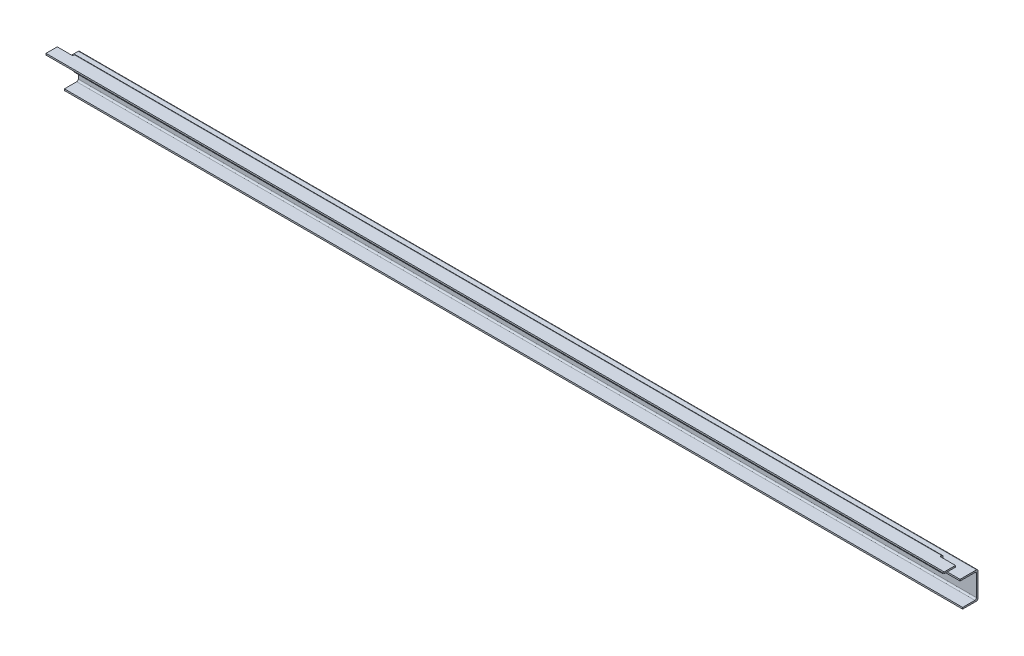
ISO-10303-21;
HEADER;
FILE_DESCRIPTION(('STEP AP214'),'2;1');
FILE_NAME('part.step','',(''),(''),'','','');
FILE_SCHEMA(('AUTOMOTIVE_DESIGN { 1 0 10303 214 1 1 1 1 }'));
ENDSEC;
DATA;
#1=APPLICATION_CONTEXT('core data for automotive mechanical design processes');
#2=APPLICATION_PROTOCOL_DEFINITION('international standard','automotive_design',2000,#1);
#3=PRODUCT_CONTEXT('',#1,'mechanical');
#4=PRODUCT('Part','Part','',(#3));
#5=PRODUCT_RELATED_PRODUCT_CATEGORY('part','',(#4));
#6=PRODUCT_DEFINITION_FORMATION('','',#4);
#7=PRODUCT_DEFINITION_CONTEXT('part definition',#1,'design');
#8=PRODUCT_DEFINITION('design','',#6,#7);
#9=PRODUCT_DEFINITION_SHAPE('','',#8);
#10=(LENGTH_UNIT() NAMED_UNIT(*) SI_UNIT(.MILLI.,.METRE.));
#11=(NAMED_UNIT(*) PLANE_ANGLE_UNIT() SI_UNIT($,.RADIAN.));
#12=(NAMED_UNIT(*) SI_UNIT($,.STERADIAN.) SOLID_ANGLE_UNIT());
#13=UNCERTAINTY_MEASURE_WITH_UNIT(LENGTH_MEASURE(1.E-05),#10,'distance_accuracy_value','');
#14=(GEOMETRIC_REPRESENTATION_CONTEXT(3) GLOBAL_UNCERTAINTY_ASSIGNED_CONTEXT((#13)) GLOBAL_UNIT_ASSIGNED_CONTEXT((#10,
#11,#12)) REPRESENTATION_CONTEXT('',''));
#15=CARTESIAN_POINT('',(0.,0.,0.));
#16=DIRECTION('',(0.,0.,1.));
#17=DIRECTION('',(1.,0.,0.));
#18=AXIS2_PLACEMENT_3D('',#15,#16,#17);
#19=CARTESIAN_POINT('',(1754.,0.,0.));
#20=DIRECTION('',(1.,0.,0.));
#21=DIRECTION('',(0.,0.,-1.));
#22=AXIS2_PLACEMENT_3D('',#19,#20,#21);
#23=PLANE('',#22);
#24=DIRECTION('',(0.,0.,-1.));
#25=VECTOR('',#24,1.);
#26=CARTESIAN_POINT('',(1754.,-3.,0.));
#27=LINE('',#26,#25);
#28=CARTESIAN_POINT('',(1754.,-3.,0.));
#29=VERTEX_POINT('',#28);
#30=CARTESIAN_POINT('',(1754.,-3.,-22.));
#31=VERTEX_POINT('',#30);
#32=EDGE_CURVE('E282',#29,#31,#27,.T.);
#33=ORIENTED_EDGE('',*,*,#32,.T.);
#34=DIRECTION('',(0.,-1.,0.));
#35=VECTOR('',#34,1.);
#36=CARTESIAN_POINT('',(1754.,0.,-22.));
#37=LINE('',#36,#35);
#38=CARTESIAN_POINT('',(1754.,0.,-22.));
#39=VERTEX_POINT('',#38);
#40=EDGE_CURVE('E245',#39,#31,#37,.T.);
#41=ORIENTED_EDGE('',*,*,#40,.F.);
#42=DIRECTION('',(0.,0.,1.));
#43=VECTOR('',#42,1.);
#44=CARTESIAN_POINT('',(1754.,0.,0.));
#45=LINE('',#44,#43);
#46=CARTESIAN_POINT('',(1754.,0.,0.));
#47=VERTEX_POINT('',#46);
#48=EDGE_CURVE('E304',#39,#47,#45,.T.);
#49=ORIENTED_EDGE('',*,*,#48,.T.);
#50=DIRECTION('',(0.,-1.,0.));
#51=VECTOR('',#50,1.);
#52=CARTESIAN_POINT('',(1754.,0.,0.));
#53=LINE('',#52,#51);
#54=EDGE_CURVE('E279',#47,#29,#53,.T.);
#55=ORIENTED_EDGE('',*,*,#54,.T.);
#56=EDGE_LOOP('',(#33,#41,#49,#55));
#57=FACE_BOUND('',#56,.T.);
#58=ADVANCED_FACE('F33',(#57),#23,.T.);
#59=CARTESIAN_POINT('',(0.,0.,0.));
#60=DIRECTION('',(1.,0.,0.));
#61=DIRECTION('',(0.,0.,-1.));
#62=AXIS2_PLACEMENT_3D('',#59,#60,#61);
#63=PLANE('',#62);
#64=DIRECTION('',(0.,1.,0.));
#65=VECTOR('',#64,1.);
#66=CARTESIAN_POINT('',(0.,-31.,-22.));
#67=LINE('',#66,#65);
#68=CARTESIAN_POINT('',(0.,-3.,-22.));
#69=VERTEX_POINT('',#68);
#70=CARTESIAN_POINT('',(0.,0.,-22.));
#71=VERTEX_POINT('',#70);
#72=EDGE_CURVE('E221',#69,#71,#67,.T.);
#73=ORIENTED_EDGE('',*,*,#72,.F.);
#74=DIRECTION('',(0.,0.,-1.));
#75=VECTOR('',#74,1.);
#76=CARTESIAN_POINT('',(0.,-3.,0.));
#77=LINE('',#76,#75);
#78=CARTESIAN_POINT('',(0.,-3.,0.));
#79=VERTEX_POINT('',#78);
#80=EDGE_CURVE('E309',#79,#69,#77,.T.);
#81=ORIENTED_EDGE('',*,*,#80,.F.);
#82=DIRECTION('',(0.,-1.,0.));
#83=VECTOR('',#82,1.);
#84=CARTESIAN_POINT('',(0.,0.,0.));
#85=LINE('',#84,#83);
#86=CARTESIAN_POINT('',(0.,0.,0.));
#87=VERTEX_POINT('',#86);
#88=EDGE_CURVE('E278',#87,#79,#85,.T.);
#89=ORIENTED_EDGE('',*,*,#88,.F.);
#90=DIRECTION('',(0.,0.,1.));
#91=VECTOR('',#90,1.);
#92=CARTESIAN_POINT('',(0.,0.,0.));
#93=LINE('',#92,#91);
#94=EDGE_CURVE('E283',#71,#87,#93,.T.);
#95=ORIENTED_EDGE('',*,*,#94,.F.);
#96=EDGE_LOOP('',(#73,#81,#89,#95));
#97=FACE_BOUND('',#96,.T.);
#98=ADVANCED_FACE('F448',(#97),#63,.F.);
#99=CARTESIAN_POINT('',(1754.,0.,0.));
#100=DIRECTION('',(0.,0.,-1.));
#101=DIRECTION('',(-1.,0.,0.));
#102=AXIS2_PLACEMENT_3D('',#99,#100,#101);
#103=PLANE('',#102);
#104=ORIENTED_EDGE('',*,*,#88,.T.);
#105=DIRECTION('',(-1.,0.,0.));
#106=VECTOR('',#105,1.);
#107=CARTESIAN_POINT('',(1754.,-3.,0.));
#108=LINE('',#107,#106);
#109=EDGE_CURVE('E339',#29,#79,#108,.T.);
#110=ORIENTED_EDGE('',*,*,#109,.F.);
#111=ORIENTED_EDGE('',*,*,#54,.F.);
#112=DIRECTION('',(-1.,0.,0.));
#113=VECTOR('',#112,1.);
#114=CARTESIAN_POINT('',(1754.,0.,0.));
#115=LINE('',#114,#113);
#116=EDGE_CURVE('E306',#47,#87,#115,.T.);
#117=ORIENTED_EDGE('',*,*,#116,.T.);
#118=EDGE_LOOP('',(#104,#110,#111,#117));
#119=FACE_BOUND('',#118,.T.);
#120=ADVANCED_FACE('F453',(#119),#103,.F.);
#121=CARTESIAN_POINT('',(1754.,-3.,0.));
#122=DIRECTION('',(0.,1.,0.));
#123=DIRECTION('',(0.,0.,1.));
#124=AXIS2_PLACEMENT_3D('',#121,#122,#123);
#125=PLANE('',#124);
#126=ORIENTED_EDGE('',*,*,#80,.T.);
#127=DIRECTION('',(-1.,0.,0.));
#128=VECTOR('',#127,1.);
#129=CARTESIAN_POINT('',(1754.,-3.,-22.));
#130=LINE('',#129,#128);
#131=CARTESIAN_POINT('',(30.,-3.,-22.));
#132=VERTEX_POINT('',#131);
#133=EDGE_CURVE('E369',#69,#132,#130,.F.);
#134=ORIENTED_EDGE('',*,*,#133,.T.);
#135=CARTESIAN_POINT('',(1724.,-3.,-22.));
#136=VERTEX_POINT('',#135);
#137=EDGE_CURVE('E373',#132,#136,#130,.F.);
#138=ORIENTED_EDGE('',*,*,#137,.T.);
#139=EDGE_CURVE('E368',#136,#31,#130,.F.);
#140=ORIENTED_EDGE('',*,*,#139,.T.);
#141=ORIENTED_EDGE('',*,*,#32,.F.);
#142=ORIENTED_EDGE('',*,*,#109,.T.);
#143=EDGE_LOOP('',(#126,#134,#138,#140,#141,#142));
#144=FACE_BOUND('',#143,.T.);
#145=ADVANCED_FACE('F444',(#144),#125,.F.);
#146=CARTESIAN_POINT('',(1754.,-3.,-25.));
#147=DIRECTION('',(0.,0.,-1.));
#148=DIRECTION('',(-1.,0.,0.));
#149=AXIS2_PLACEMENT_3D('',#146,#147,#148);
#150=PLANE('',#149);
#151=DIRECTION('',(-1.,0.,0.));
#152=VECTOR('',#151,1.);
#153=CARTESIAN_POINT('',(0.,-6.,-25.));
#154=LINE('',#153,#152);
#155=CARTESIAN_POINT('',(1724.,-6.,-25.));
#156=VERTEX_POINT('',#155);
#157=CARTESIAN_POINT('',(30.,-6.,-25.));
#158=VERTEX_POINT('',#157);
#159=EDGE_CURVE('E358',#156,#158,#154,.T.);
#160=ORIENTED_EDGE('',*,*,#159,.T.);
#161=DIRECTION('',(0.,-1.,0.));
#162=VECTOR('',#161,1.);
#163=CARTESIAN_POINT('',(30.,-2.99999999999981,-25.));
#164=LINE('',#163,#162);
#165=CARTESIAN_POINT('',(30.,-28.,-25.));
#166=VERTEX_POINT('',#165);
#167=EDGE_CURVE('E273',#158,#166,#164,.T.);
#168=ORIENTED_EDGE('',*,*,#167,.T.);
#169=DIRECTION('',(-1.,0.,0.));
#170=VECTOR('',#169,1.);
#171=CARTESIAN_POINT('',(1754.,-28.,-25.));
#172=LINE('',#171,#170);
#173=CARTESIAN_POINT('',(1724.,-28.,-25.));
#174=VERTEX_POINT('',#173);
#175=EDGE_CURVE('E361',#166,#174,#172,.F.);
#176=ORIENTED_EDGE('',*,*,#175,.T.);
#177=DIRECTION('',(0.,1.,0.));
#178=VECTOR('',#177,1.);
#179=CARTESIAN_POINT('',(1724.,-3.,-25.));
#180=LINE('',#179,#178);
#181=EDGE_CURVE('E261',#174,#156,#180,.T.);
#182=ORIENTED_EDGE('',*,*,#181,.T.);
#183=EDGE_LOOP('',(#160,#168,#176,#182));
#184=FACE_BOUND('',#183,.T.);
#185=ADVANCED_FACE('F460',(#184),#150,.F.);
#186=CARTESIAN_POINT('',(1754.,-31.,-25.));
#187=DIRECTION('',(0.,1.,0.));
#188=DIRECTION('',(0.,0.,1.));
#189=AXIS2_PLACEMENT_3D('',#186,#187,#188);
#190=PLANE('',#189);
#191=DIRECTION('',(-1.,0.,0.));
#192=VECTOR('',#191,1.);
#193=CARTESIAN_POINT('',(1754.,-31.,-28.));
#194=LINE('',#193,#192);
#195=CARTESIAN_POINT('',(1724.,-31.,-28.));
#196=VERTEX_POINT('',#195);
#197=CARTESIAN_POINT('',(30.,-31.,-28.));
#198=VERTEX_POINT('',#197);
#199=EDGE_CURVE('E227',#196,#198,#194,.T.);
#200=ORIENTED_EDGE('',*,*,#199,.T.);
#201=DIRECTION('',(0.,0.,-1.));
#202=VECTOR('',#201,1.);
#203=CARTESIAN_POINT('',(30.,-31.,-22.));
#204=LINE('',#203,#202);
#205=CARTESIAN_POINT('',(30.,-31.,-31.));
#206=VERTEX_POINT('',#205);
#207=EDGE_CURVE('E207',#198,#206,#204,.T.);
#208=ORIENTED_EDGE('',*,*,#207,.T.);
#209=DIRECTION('',(-1.,0.,0.));
#210=VECTOR('',#209,1.);
#211=CARTESIAN_POINT('',(30.,-31.,-31.));
#212=LINE('',#211,#210);
#213=CARTESIAN_POINT('',(0.,-31.,-31.));
#214=VERTEX_POINT('',#213);
#215=EDGE_CURVE('E213',#206,#214,#212,.T.);
#216=ORIENTED_EDGE('',*,*,#215,.T.);
#217=DIRECTION('',(0.,0.,-1.));
#218=VECTOR('',#217,1.);
#219=CARTESIAN_POINT('',(0.,-31.,-25.));
#220=LINE('',#219,#218);
#221=CARTESIAN_POINT('',(0.,-31.,-60.));
#222=VERTEX_POINT('',#221);
#223=EDGE_CURVE('E312',#214,#222,#220,.T.);
#224=ORIENTED_EDGE('',*,*,#223,.T.);
#225=DIRECTION('',(-1.,0.,0.));
#226=VECTOR('',#225,1.);
#227=CARTESIAN_POINT('',(1754.,-31.,-60.));
#228=LINE('',#227,#226);
#229=CARTESIAN_POINT('',(1754.,-31.,-60.));
#230=VERTEX_POINT('',#229);
#231=EDGE_CURVE('E351',#222,#230,#228,.F.);
#232=ORIENTED_EDGE('',*,*,#231,.T.);
#233=DIRECTION('',(0.,0.,-1.));
#234=VECTOR('',#233,1.);
#235=CARTESIAN_POINT('',(1754.,-31.,-25.));
#236=LINE('',#235,#234);
#237=CARTESIAN_POINT('',(1754.,-31.,-31.));
#238=VERTEX_POINT('',#237);
#239=EDGE_CURVE('E286',#238,#230,#236,.T.);
#240=ORIENTED_EDGE('',*,*,#239,.F.);
#241=DIRECTION('',(-1.,0.,0.));
#242=VECTOR('',#241,1.);
#243=CARTESIAN_POINT('',(1754.,-31.,-31.));
#244=LINE('',#243,#242);
#245=CARTESIAN_POINT('',(1724.,-31.,-31.));
#246=VERTEX_POINT('',#245);
#247=EDGE_CURVE('E239',#238,#246,#244,.T.);
#248=ORIENTED_EDGE('',*,*,#247,.T.);
#249=DIRECTION('',(0.,0.,-1.));
#250=VECTOR('',#249,1.);
#251=CARTESIAN_POINT('',(1724.,-31.,-22.));
#252=LINE('',#251,#250);
#253=EDGE_CURVE('E251',#196,#246,#252,.T.);
#254=ORIENTED_EDGE('',*,*,#253,.F.);
#255=EDGE_LOOP('',(#200,#208,#216,#224,#232,#240,#248,#254));
#256=FACE_BOUND('',#255,.T.);
#257=ADVANCED_FACE('F224',(#256),#190,.F.);
#258=CARTESIAN_POINT('',(1754.,-31.,-63.));
#259=DIRECTION('',(0.,0.,-1.));
#260=DIRECTION('',(-1.,0.,0.));
#261=AXIS2_PLACEMENT_3D('',#258,#259,#260);
#262=PLANE('',#261);
#263=DIRECTION('',(0.,-1.,0.));
#264=VECTOR('',#263,1.);
#265=CARTESIAN_POINT('',(0.,-31.,-63.));
#266=LINE('',#265,#264);
#267=CARTESIAN_POINT('',(0.,-34.,-63.));
#268=VERTEX_POINT('',#267);
#269=CARTESIAN_POINT('',(0.,-75.,-63.));
#270=VERTEX_POINT('',#269);
#271=EDGE_CURVE('E314',#268,#270,#266,.T.);
#272=ORIENTED_EDGE('',*,*,#271,.T.);
#273=DIRECTION('',(-1.,0.,0.));
#274=VECTOR('',#273,1.);
#275=CARTESIAN_POINT('',(1754.,-75.,-63.));
#276=LINE('',#275,#274);
#277=CARTESIAN_POINT('',(1754.,-75.,-63.));
#278=VERTEX_POINT('',#277);
#279=EDGE_CURVE('E348',#270,#278,#276,.F.);
#280=ORIENTED_EDGE('',*,*,#279,.T.);
#281=DIRECTION('',(0.,-1.,0.));
#282=VECTOR('',#281,1.);
#283=CARTESIAN_POINT('',(1754.,-31.,-63.));
#284=LINE('',#283,#282);
#285=CARTESIAN_POINT('',(1754.,-34.,-63.));
#286=VERTEX_POINT('',#285);
#287=EDGE_CURVE('E288',#286,#278,#284,.T.);
#288=ORIENTED_EDGE('',*,*,#287,.F.);
#289=DIRECTION('',(-1.,0.,0.));
#290=VECTOR('',#289,1.);
#291=CARTESIAN_POINT('',(0.,-34.,-63.));
#292=LINE('',#291,#290);
#293=EDGE_CURVE('E345',#286,#268,#292,.T.);
#294=ORIENTED_EDGE('',*,*,#293,.T.);
#295=EDGE_LOOP('',(#272,#280,#288,#294));
#296=FACE_BOUND('',#295,.T.);
#297=ADVANCED_FACE('F506',(#296),#262,.F.);
#298=CARTESIAN_POINT('',(1754.,-78.,-63.));
#299=DIRECTION('',(0.,-1.,0.));
#300=DIRECTION('',(0.,0.,-1.));
#301=AXIS2_PLACEMENT_3D('',#298,#299,#300);
#302=PLANE('',#301);
#303=DIRECTION('',(0.,0.,1.));
#304=VECTOR('',#303,1.);
#305=CARTESIAN_POINT('',(1754.,-78.,-63.));
#306=LINE('',#305,#304);
#307=CARTESIAN_POINT('',(1754.,-78.,-60.));
#308=VERTEX_POINT('',#307);
#309=CARTESIAN_POINT('',(1754.,-78.,-36.));
#310=VERTEX_POINT('',#309);
#311=EDGE_CURVE('E291',#308,#310,#306,.T.);
#312=ORIENTED_EDGE('',*,*,#311,.F.);
#313=DIRECTION('',(-1.,0.,0.));
#314=VECTOR('',#313,1.);
#315=CARTESIAN_POINT('',(0.,-78.,-60.));
#316=LINE('',#315,#314);
#317=CARTESIAN_POINT('',(0.,-78.,-60.));
#318=VERTEX_POINT('',#317);
#319=EDGE_CURVE('E342',#308,#318,#316,.T.);
#320=ORIENTED_EDGE('',*,*,#319,.T.);
#321=DIRECTION('',(0.,0.,1.));
#322=VECTOR('',#321,1.);
#323=CARTESIAN_POINT('',(0.,-78.,-63.));
#324=LINE('',#323,#322);
#325=CARTESIAN_POINT('',(0.,-78.,-36.));
#326=VERTEX_POINT('',#325);
#327=EDGE_CURVE('E317',#318,#326,#324,.T.);
#328=ORIENTED_EDGE('',*,*,#327,.T.);
#329=DIRECTION('',(-1.,0.,0.));
#330=VECTOR('',#329,1.);
#331=CARTESIAN_POINT('',(1754.,-78.,-36.));
#332=LINE('',#331,#330);
#333=EDGE_CURVE('E336',#310,#326,#332,.T.);
#334=ORIENTED_EDGE('',*,*,#333,.F.);
#335=EDGE_LOOP('',(#312,#320,#328,#334));
#336=FACE_BOUND('',#335,.T.);
#337=ADVANCED_FACE('F498',(#336),#302,.F.);
#338=CARTESIAN_POINT('',(1754.,-78.,-36.));
#339=DIRECTION('',(0.,0.,-1.));
#340=DIRECTION('',(-1.,0.,0.));
#341=AXIS2_PLACEMENT_3D('',#338,#339,#340);
#342=PLANE('',#341);
#343=DIRECTION('',(0.,-1.,0.));
#344=VECTOR('',#343,1.);
#345=CARTESIAN_POINT('',(0.,-78.,-36.));
#346=LINE('',#345,#344);
#347=CARTESIAN_POINT('',(0.,-81.,-36.));
#348=VERTEX_POINT('',#347);
#349=EDGE_CURVE('E319',#326,#348,#346,.T.);
#350=ORIENTED_EDGE('',*,*,#349,.T.);
#351=DIRECTION('',(-1.,0.,0.));
#352=VECTOR('',#351,1.);
#353=CARTESIAN_POINT('',(1754.,-81.,-36.));
#354=LINE('',#353,#352);
#355=CARTESIAN_POINT('',(1754.,-81.,-36.));
#356=VERTEX_POINT('',#355);
#357=EDGE_CURVE('E333',#356,#348,#354,.T.);
#358=ORIENTED_EDGE('',*,*,#357,.F.);
#359=DIRECTION('',(0.,-1.,0.));
#360=VECTOR('',#359,1.);
#361=CARTESIAN_POINT('',(1754.,-78.,-36.));
#362=LINE('',#361,#360);
#363=EDGE_CURVE('E293',#310,#356,#362,.T.);
#364=ORIENTED_EDGE('',*,*,#363,.F.);
#365=ORIENTED_EDGE('',*,*,#333,.T.);
#366=EDGE_LOOP('',(#350,#358,#364,#365));
#367=FACE_BOUND('',#366,.T.);
#368=ADVANCED_FACE('F492',(#367),#342,.F.);
#369=CARTESIAN_POINT('',(1754.,-81.,-66.));
#370=DIRECTION('',(0.,1.,0.));
#371=DIRECTION('',(0.,0.,1.));
#372=AXIS2_PLACEMENT_3D('',#369,#370,#371);
#373=PLANE('',#372);
#374=DIRECTION('',(0.,0.,-1.));
#375=VECTOR('',#374,1.);
#376=CARTESIAN_POINT('',(0.,-81.,-66.));
#377=LINE('',#376,#375);
#378=CARTESIAN_POINT('',(0.,-81.,-63.));
#379=VERTEX_POINT('',#378);
#380=EDGE_CURVE('E321',#348,#379,#377,.T.);
#381=ORIENTED_EDGE('',*,*,#380,.T.);
#382=DIRECTION('',(-1.,0.,0.));
#383=VECTOR('',#382,1.);
#384=CARTESIAN_POINT('',(1754.,-81.,-63.));
#385=LINE('',#384,#383);
#386=CARTESIAN_POINT('',(1754.,-81.,-63.));
#387=VERTEX_POINT('',#386);
#388=EDGE_CURVE('E378',#379,#387,#385,.F.);
#389=ORIENTED_EDGE('',*,*,#388,.T.);
#390=DIRECTION('',(0.,0.,-1.));
#391=VECTOR('',#390,1.);
#392=CARTESIAN_POINT('',(1754.,-81.,-66.));
#393=LINE('',#392,#391);
#394=EDGE_CURVE('E295',#356,#387,#393,.T.);
#395=ORIENTED_EDGE('',*,*,#394,.F.);
#396=ORIENTED_EDGE('',*,*,#357,.T.);
#397=EDGE_LOOP('',(#381,#389,#395,#396));
#398=FACE_BOUND('',#397,.T.);
#399=ADVANCED_FACE('F487',(#398),#373,.F.);
#400=CARTESIAN_POINT('',(1754.,-28.,-66.));
#401=DIRECTION('',(0.,0.,1.));
#402=DIRECTION('',(0.,-1.,0.));
#403=AXIS2_PLACEMENT_3D('',#400,#401,#402);
#404=PLANE('',#403);
#405=DIRECTION('',(0.,1.,0.));
#406=VECTOR('',#405,1.);
#407=CARTESIAN_POINT('',(1754.,-28.,-66.));
#408=LINE('',#407,#406);
#409=CARTESIAN_POINT('',(1754.,-78.,-66.));
#410=VERTEX_POINT('',#409);
#411=CARTESIAN_POINT('',(1754.,-31.,-66.));
#412=VERTEX_POINT('',#411);
#413=EDGE_CURVE('E298',#410,#412,#408,.T.);
#414=ORIENTED_EDGE('',*,*,#413,.F.);
#415=DIRECTION('',(-1.,0.,0.));
#416=VECTOR('',#415,1.);
#417=CARTESIAN_POINT('',(1754.,-78.,-66.));
#418=LINE('',#417,#416);
#419=CARTESIAN_POINT('',(0.,-78.,-66.));
#420=VERTEX_POINT('',#419);
#421=EDGE_CURVE('E375',#410,#420,#418,.T.);
#422=ORIENTED_EDGE('',*,*,#421,.T.);
#423=DIRECTION('',(0.,1.,0.));
#424=VECTOR('',#423,1.);
#425=CARTESIAN_POINT('',(0.,-28.,-66.));
#426=LINE('',#425,#424);
#427=CARTESIAN_POINT('',(0.,-31.,-66.));
#428=VERTEX_POINT('',#427);
#429=EDGE_CURVE('E324',#420,#428,#426,.T.);
#430=ORIENTED_EDGE('',*,*,#429,.T.);
#431=DIRECTION('',(-1.,0.,0.));
#432=VECTOR('',#431,1.);
#433=CARTESIAN_POINT('',(1754.,-31.,-66.));
#434=LINE('',#433,#432);
#435=EDGE_CURVE('E372',#428,#412,#434,.F.);
#436=ORIENTED_EDGE('',*,*,#435,.T.);
#437=EDGE_LOOP('',(#414,#422,#430,#436));
#438=FACE_BOUND('',#437,.T.);
#439=ADVANCED_FACE('F478',(#438),#404,.F.);
#440=CARTESIAN_POINT('',(1754.,-28.,-28.));
#441=DIRECTION('',(0.,-1.,0.));
#442=DIRECTION('',(0.,0.,-1.));
#443=AXIS2_PLACEMENT_3D('',#440,#441,#442);
#444=PLANE('',#443);
#445=DIRECTION('',(0.,0.,1.));
#446=VECTOR('',#445,1.);
#447=CARTESIAN_POINT('',(1754.,-28.,-28.));
#448=LINE('',#447,#446);
#449=CARTESIAN_POINT('',(1754.,-28.,-63.));
#450=VERTEX_POINT('',#449);
#451=CARTESIAN_POINT('',(1754.,-28.,-31.));
#452=VERTEX_POINT('',#451);
#453=EDGE_CURVE('E301',#450,#452,#448,.T.);
#454=ORIENTED_EDGE('',*,*,#453,.F.);
#455=DIRECTION('',(-1.,0.,0.));
#456=VECTOR('',#455,1.);
#457=CARTESIAN_POINT('',(1754.,-28.,-63.));
#458=LINE('',#457,#456);
#459=CARTESIAN_POINT('',(0.,-28.,-63.));
#460=VERTEX_POINT('',#459);
#461=EDGE_CURVE('E384',#450,#460,#458,.T.);
#462=ORIENTED_EDGE('',*,*,#461,.T.);
#463=DIRECTION('',(0.,0.,1.));
#464=VECTOR('',#463,1.);
#465=CARTESIAN_POINT('',(0.,-28.,-28.));
#466=LINE('',#465,#464);
#467=CARTESIAN_POINT('',(0.,-28.,-31.));
#468=VERTEX_POINT('',#467);
#469=EDGE_CURVE('E327',#460,#468,#466,.T.);
#470=ORIENTED_EDGE('',*,*,#469,.T.);
#471=DIRECTION('',(-1.,0.,0.));
#472=VECTOR('',#471,1.);
#473=CARTESIAN_POINT('',(1754.,-28.,-31.));
#474=LINE('',#473,#472);
#475=CARTESIAN_POINT('',(30.,-28.,-31.));
#476=VERTEX_POINT('',#475);
#477=EDGE_CURVE('E381',#468,#476,#474,.F.);
#478=ORIENTED_EDGE('',*,*,#477,.T.);
#479=CARTESIAN_POINT('',(1724.,-28.,-31.));
#480=VERTEX_POINT('',#479);
#481=EDGE_CURVE('E385',#476,#480,#474,.F.);
#482=ORIENTED_EDGE('',*,*,#481,.T.);
#483=EDGE_CURVE('E380',#480,#452,#474,.F.);
#484=ORIENTED_EDGE('',*,*,#483,.T.);
#485=EDGE_LOOP('',(#454,#462,#470,#478,#482,#484));
#486=FACE_BOUND('',#485,.T.);
#487=ADVANCED_FACE('F424',(#486),#444,.F.);
#488=CARTESIAN_POINT('',(1754.,0.,-28.));
#489=DIRECTION('',(0.,0.,1.));
#490=DIRECTION('',(0.,-1.,0.));
#491=AXIS2_PLACEMENT_3D('',#488,#489,#490);
#492=PLANE('',#491);
#493=DIRECTION('',(-1.,0.,0.));
#494=VECTOR('',#493,1.);
#495=CARTESIAN_POINT('',(0.,-25.,-28.));
#496=LINE('',#495,#494);
#497=CARTESIAN_POINT('',(1724.,-25.,-28.));
#498=VERTEX_POINT('',#497);
#499=CARTESIAN_POINT('',(30.,-25.,-28.));
#500=VERTEX_POINT('',#499);
#501=EDGE_CURVE('E391',#498,#500,#496,.T.);
#502=ORIENTED_EDGE('',*,*,#501,.T.);
#503=DIRECTION('',(0.,1.,0.));
#504=VECTOR('',#503,1.);
#505=CARTESIAN_POINT('',(30.,1.92946017586065E-13,-28.));
#506=LINE('',#505,#504);
#507=CARTESIAN_POINT('',(30.,-3.,-28.));
#508=VERTEX_POINT('',#507);
#509=EDGE_CURVE('E266',#500,#508,#506,.T.);
#510=ORIENTED_EDGE('',*,*,#509,.T.);
#511=DIRECTION('',(-1.,0.,0.));
#512=VECTOR('',#511,1.);
#513=CARTESIAN_POINT('',(1754.,-3.,-28.));
#514=LINE('',#513,#512);
#515=CARTESIAN_POINT('',(1724.,-3.,-28.));
#516=VERTEX_POINT('',#515);
#517=EDGE_CURVE('E388',#508,#516,#514,.F.);
#518=ORIENTED_EDGE('',*,*,#517,.T.);
#519=DIRECTION('',(0.,-1.,0.));
#520=VECTOR('',#519,1.);
#521=CARTESIAN_POINT('',(1724.,0.,-28.));
#522=LINE('',#521,#520);
#523=EDGE_CURVE('E55',#516,#498,#522,.T.);
#524=ORIENTED_EDGE('',*,*,#523,.T.);
#525=EDGE_LOOP('',(#502,#510,#518,#524));
#526=FACE_BOUND('',#525,.T.);
#527=ADVANCED_FACE('F416',(#526),#492,.F.);
#528=CARTESIAN_POINT('',(1754.,0.,0.));
#529=DIRECTION('',(0.,-1.,0.));
#530=DIRECTION('',(0.,0.,-1.));
#531=AXIS2_PLACEMENT_3D('',#528,#529,#530);
#532=PLANE('',#531);
#533=DIRECTION('',(-1.,0.,0.));
#534=VECTOR('',#533,1.);
#535=CARTESIAN_POINT('',(1754.,0.,-25.));
#536=LINE('',#535,#534);
#537=CARTESIAN_POINT('',(1724.,0.,-25.));
#538=VERTEX_POINT('',#537);
#539=CARTESIAN_POINT('',(30.,0.,-25.));
#540=VERTEX_POINT('',#539);
#541=EDGE_CURVE('E394',#538,#540,#536,.T.);
#542=ORIENTED_EDGE('',*,*,#541,.T.);
#543=DIRECTION('',(0.,0.,-1.));
#544=VECTOR('',#543,1.);
#545=CARTESIAN_POINT('',(30.,0.,-22.));
#546=LINE('',#545,#544);
#547=CARTESIAN_POINT('',(30.,0.,-22.));
#548=VERTEX_POINT('',#547);
#549=EDGE_CURVE('E47',#548,#540,#546,.T.);
#550=ORIENTED_EDGE('',*,*,#549,.F.);
#551=DIRECTION('',(1.,0.,0.));
#552=VECTOR('',#551,1.);
#553=CARTESIAN_POINT('',(0.,0.,-22.));
#554=LINE('',#553,#552);
#555=EDGE_CURVE('E430',#71,#548,#554,.T.);
#556=ORIENTED_EDGE('',*,*,#555,.F.);
#557=ORIENTED_EDGE('',*,*,#94,.T.);
#558=ORIENTED_EDGE('',*,*,#116,.F.);
#559=ORIENTED_EDGE('',*,*,#48,.F.);
#560=DIRECTION('',(1.,0.,0.));
#561=VECTOR('',#560,1.);
#562=CARTESIAN_POINT('',(1754.,0.,-22.));
#563=LINE('',#562,#561);
#564=CARTESIAN_POINT('',(1724.,0.,-22.));
#565=VERTEX_POINT('',#564);
#566=EDGE_CURVE('E249',#565,#39,#563,.T.);
#567=ORIENTED_EDGE('',*,*,#566,.F.);
#568=DIRECTION('',(0.,0.,-1.));
#569=VECTOR('',#568,1.);
#570=CARTESIAN_POINT('',(1724.,0.,-22.));
#571=LINE('',#570,#569);
#572=EDGE_CURVE('E252',#565,#538,#571,.T.);
#573=ORIENTED_EDGE('',*,*,#572,.T.);
#574=EDGE_LOOP('',(#542,#550,#556,#557,#558,#559,#567,#573));
#575=FACE_BOUND('',#574,.T.);
#576=ADVANCED_FACE('F413',(#575),#532,.F.);
#577=DIRECTION('',(0.,-1.,0.));
#578=VECTOR('',#577,1.);
#579=CARTESIAN_POINT('',(1754.,0.,-31.));
#580=LINE('',#579,#578);
#581=EDGE_CURVE('E236',#452,#238,#580,.T.);
#582=ORIENTED_EDGE('',*,*,#581,.T.);
#583=ORIENTED_EDGE('',*,*,#239,.T.);
#584=CARTESIAN_POINT('',(1754.,-34.,-60.));
#585=DIRECTION('',(1.,0.,0.));
#586=DIRECTION('',(0.,0.,-1.));
#587=AXIS2_PLACEMENT_3D('',#584,#585,#586);
#588=CIRCLE('',#587,3.);
#589=EDGE_CURVE('E404',#230,#286,#588,.F.);
#590=ORIENTED_EDGE('',*,*,#589,.T.);
#591=ORIENTED_EDGE('',*,*,#287,.T.);
#592=CARTESIAN_POINT('',(1754.,-75.,-60.));
#593=DIRECTION('',(1.,0.,0.));
#594=DIRECTION('',(0.,0.,-1.));
#595=AXIS2_PLACEMENT_3D('',#592,#593,#594);
#596=CIRCLE('',#595,3.);
#597=EDGE_CURVE('E399',#278,#308,#596,.F.);
#598=ORIENTED_EDGE('',*,*,#597,.T.);
#599=ORIENTED_EDGE('',*,*,#311,.T.);
#600=ORIENTED_EDGE('',*,*,#363,.T.);
#601=ORIENTED_EDGE('',*,*,#394,.T.);
#602=CARTESIAN_POINT('',(1754.,-78.,-63.));
#603=DIRECTION('',(1.,0.,0.));
#604=DIRECTION('',(0.,0.,-1.));
#605=AXIS2_PLACEMENT_3D('',#602,#603,#604);
#606=CIRCLE('',#605,3.);
#607=EDGE_CURVE('E366',#387,#410,#606,.T.);
#608=ORIENTED_EDGE('',*,*,#607,.T.);
#609=ORIENTED_EDGE('',*,*,#413,.T.);
#610=CARTESIAN_POINT('',(1754.,-31.,-63.));
#611=DIRECTION('',(1.,0.,0.));
#612=DIRECTION('',(0.,0.,-1.));
#613=AXIS2_PLACEMENT_3D('',#610,#611,#612);
#614=CIRCLE('',#613,3.);
#615=EDGE_CURVE('E364',#412,#450,#614,.T.);
#616=ORIENTED_EDGE('',*,*,#615,.T.);
#617=ORIENTED_EDGE('',*,*,#453,.T.);
#618=EDGE_LOOP('',(#582,#583,#590,#591,#598,#599,#600,#601,#608,#609,#616,#617));
#619=FACE_BOUND('',#618,.T.);
#620=ADVANCED_FACE('F469',(#619),#23,.T.);
#621=ORIENTED_EDGE('',*,*,#223,.F.);
#622=DIRECTION('',(0.,1.,0.));
#623=VECTOR('',#622,1.);
#624=CARTESIAN_POINT('',(0.,-31.,-31.));
#625=LINE('',#624,#623);
#626=EDGE_CURVE('E214',#214,#468,#625,.T.);
#627=ORIENTED_EDGE('',*,*,#626,.T.);
#628=ORIENTED_EDGE('',*,*,#469,.F.);
#629=CARTESIAN_POINT('',(0.,-31.,-63.));
#630=DIRECTION('',(1.,0.,0.));
#631=DIRECTION('',(0.,0.,-1.));
#632=AXIS2_PLACEMENT_3D('',#629,#630,#631);
#633=CIRCLE('',#632,3.);
#634=EDGE_CURVE('E354',#460,#428,#633,.F.);
#635=ORIENTED_EDGE('',*,*,#634,.T.);
#636=ORIENTED_EDGE('',*,*,#429,.F.);
#637=CARTESIAN_POINT('',(0.,-78.,-63.));
#638=DIRECTION('',(1.,0.,0.));
#639=DIRECTION('',(0.,0.,-1.));
#640=AXIS2_PLACEMENT_3D('',#637,#638,#639);
#641=CIRCLE('',#640,3.);
#642=EDGE_CURVE('E356',#420,#379,#641,.F.);
#643=ORIENTED_EDGE('',*,*,#642,.T.);
#644=ORIENTED_EDGE('',*,*,#380,.F.);
#645=ORIENTED_EDGE('',*,*,#349,.F.);
#646=ORIENTED_EDGE('',*,*,#327,.F.);
#647=CARTESIAN_POINT('',(0.,-75.,-60.));
#648=DIRECTION('',(1.,0.,0.));
#649=DIRECTION('',(0.,0.,-1.));
#650=AXIS2_PLACEMENT_3D('',#647,#648,#649);
#651=CIRCLE('',#650,3.);
#652=EDGE_CURVE('E397',#318,#270,#651,.T.);
#653=ORIENTED_EDGE('',*,*,#652,.T.);
#654=ORIENTED_EDGE('',*,*,#271,.F.);
#655=CARTESIAN_POINT('',(0.,-34.,-60.));
#656=DIRECTION('',(1.,0.,0.));
#657=DIRECTION('',(0.,0.,-1.));
#658=AXIS2_PLACEMENT_3D('',#655,#656,#657);
#659=CIRCLE('',#658,3.);
#660=EDGE_CURVE('E401',#268,#222,#659,.T.);
#661=ORIENTED_EDGE('',*,*,#660,.T.);
#662=EDGE_LOOP('',(#621,#627,#628,#635,#636,#643,#644,#645,#646,#653,#654,#661));
#663=FACE_BOUND('',#662,.T.);
#664=ADVANCED_FACE('F427',(#663),#63,.F.);
#665=CARTESIAN_POINT('',(1754.,-75.,-60.));
#666=DIRECTION('',(1.,0.,0.));
#667=DIRECTION('',(0.,0.,-1.));
#668=AXIS2_PLACEMENT_3D('',#665,#666,#667);
#669=CYLINDRICAL_SURFACE('',#668,3.);
#670=ORIENTED_EDGE('',*,*,#597,.F.);
#671=ORIENTED_EDGE('',*,*,#279,.F.);
#672=ORIENTED_EDGE('',*,*,#652,.F.);
#673=ORIENTED_EDGE('',*,*,#319,.F.);
#674=EDGE_LOOP('',(#670,#671,#672,#673));
#675=FACE_BOUND('',#674,.T.);
#676=ADVANCED_FACE('F502',(#675),#669,.F.);
#677=CARTESIAN_POINT('',(1754.,-34.,-60.));
#678=DIRECTION('',(1.,0.,0.));
#679=DIRECTION('',(0.,0.,-1.));
#680=AXIS2_PLACEMENT_3D('',#677,#678,#679);
#681=CYLINDRICAL_SURFACE('',#680,3.);
#682=ORIENTED_EDGE('',*,*,#589,.F.);
#683=ORIENTED_EDGE('',*,*,#231,.F.);
#684=ORIENTED_EDGE('',*,*,#660,.F.);
#685=ORIENTED_EDGE('',*,*,#293,.F.);
#686=EDGE_LOOP('',(#682,#683,#684,#685));
#687=FACE_BOUND('',#686,.T.);
#688=ADVANCED_FACE('F511',(#687),#681,.F.);
#689=CARTESIAN_POINT('',(1754.,-28.,-28.));
#690=DIRECTION('',(-1.,0.,0.));
#691=DIRECTION('',(0.,0.,1.));
#692=AXIS2_PLACEMENT_3D('',#689,#690,#691);
#693=CYLINDRICAL_SURFACE('',#692,3.);
#694=CARTESIAN_POINT('',(30.,-28.,-28.));
#695=DIRECTION('',(1.,0.,0.));
#696=DIRECTION('',(0.,1.,0.));
#697=AXIS2_PLACEMENT_3D('',#694,#695,#696);
#698=CIRCLE('',#697,3.);
#699=EDGE_CURVE('E276',#198,#166,#698,.F.);
#700=ORIENTED_EDGE('',*,*,#699,.F.);
#701=ORIENTED_EDGE('',*,*,#199,.F.);
#702=CARTESIAN_POINT('',(1724.,-28.,-28.));
#703=DIRECTION('',(-1.,0.,0.));
#704=DIRECTION('',(0.,0.,1.));
#705=AXIS2_PLACEMENT_3D('',#702,#703,#704);
#706=CIRCLE('',#705,3.);
#707=EDGE_CURVE('E264',#174,#196,#706,.F.);
#708=ORIENTED_EDGE('',*,*,#707,.F.);
#709=ORIENTED_EDGE('',*,*,#175,.F.);
#710=EDGE_LOOP('',(#700,#701,#708,#709));
#711=FACE_BOUND('',#710,.T.);
#712=ADVANCED_FACE('F463',(#711),#693,.T.);
#713=CARTESIAN_POINT('',(1754.,-6.,-22.));
#714=DIRECTION('',(1.,0.,0.));
#715=DIRECTION('',(0.,0.,-1.));
#716=AXIS2_PLACEMENT_3D('',#713,#714,#715);
#717=CYLINDRICAL_SURFACE('',#716,3.);
#718=ORIENTED_EDGE('',*,*,#137,.F.);
#719=CARTESIAN_POINT('',(30.,-6.,-22.));
#720=DIRECTION('',(1.,0.,0.));
#721=DIRECTION('',(0.,1.,0.));
#722=AXIS2_PLACEMENT_3D('',#719,#720,#721);
#723=CIRCLE('',#722,3.);
#724=EDGE_CURVE('E270',#132,#158,#723,.F.);
#725=ORIENTED_EDGE('',*,*,#724,.T.);
#726=ORIENTED_EDGE('',*,*,#159,.F.);
#727=CARTESIAN_POINT('',(1724.,-6.,-22.));
#728=DIRECTION('',(-1.,0.,0.));
#729=DIRECTION('',(0.,0.,1.));
#730=AXIS2_PLACEMENT_3D('',#727,#728,#729);
#731=CIRCLE('',#730,3.);
#732=EDGE_CURVE('E258',#156,#136,#731,.F.);
#733=ORIENTED_EDGE('',*,*,#732,.T.);
#734=EDGE_LOOP('',(#718,#725,#726,#733));
#735=FACE_BOUND('',#734,.T.);
#736=ADVANCED_FACE('F440',(#735),#717,.F.);
#737=CARTESIAN_POINT('',(1754.,-78.,-63.));
#738=DIRECTION('',(-1.,0.,0.));
#739=DIRECTION('',(0.,0.,1.));
#740=AXIS2_PLACEMENT_3D('',#737,#738,#739);
#741=CYLINDRICAL_SURFACE('',#740,3.);
#742=ORIENTED_EDGE('',*,*,#607,.F.);
#743=ORIENTED_EDGE('',*,*,#388,.F.);
#744=ORIENTED_EDGE('',*,*,#642,.F.);
#745=ORIENTED_EDGE('',*,*,#421,.F.);
#746=EDGE_LOOP('',(#742,#743,#744,#745));
#747=FACE_BOUND('',#746,.T.);
#748=ADVANCED_FACE('F482',(#747),#741,.T.);
#749=CARTESIAN_POINT('',(1754.,-31.,-63.));
#750=DIRECTION('',(-1.,0.,0.));
#751=DIRECTION('',(0.,0.,1.));
#752=AXIS2_PLACEMENT_3D('',#749,#750,#751);
#753=CYLINDRICAL_SURFACE('',#752,3.);
#754=ORIENTED_EDGE('',*,*,#615,.F.);
#755=ORIENTED_EDGE('',*,*,#435,.F.);
#756=ORIENTED_EDGE('',*,*,#634,.F.);
#757=ORIENTED_EDGE('',*,*,#461,.F.);
#758=EDGE_LOOP('',(#754,#755,#756,#757));
#759=FACE_BOUND('',#758,.T.);
#760=ADVANCED_FACE('F473',(#759),#753,.T.);
#761=CARTESIAN_POINT('',(1754.,-25.,-31.));
#762=DIRECTION('',(1.,0.,0.));
#763=DIRECTION('',(0.,0.,-1.));
#764=AXIS2_PLACEMENT_3D('',#761,#762,#763);
#765=CYLINDRICAL_SURFACE('',#764,3.);
#766=ORIENTED_EDGE('',*,*,#481,.F.);
#767=CARTESIAN_POINT('',(30.,-25.,-31.));
#768=DIRECTION('',(1.,0.,0.));
#769=DIRECTION('',(0.,1.,0.));
#770=AXIS2_PLACEMENT_3D('',#767,#768,#769);
#771=CIRCLE('',#770,3.);
#772=EDGE_CURVE('E210',#476,#500,#771,.F.);
#773=ORIENTED_EDGE('',*,*,#772,.T.);
#774=ORIENTED_EDGE('',*,*,#501,.F.);
#775=CARTESIAN_POINT('',(1724.,-25.,-31.));
#776=DIRECTION('',(-1.,0.,0.));
#777=DIRECTION('',(0.,0.,1.));
#778=AXIS2_PLACEMENT_3D('',#775,#776,#777);
#779=CIRCLE('',#778,3.);
#780=EDGE_CURVE('E229',#498,#480,#779,.F.);
#781=ORIENTED_EDGE('',*,*,#780,.T.);
#782=EDGE_LOOP('',(#766,#773,#774,#781));
#783=FACE_BOUND('',#782,.T.);
#784=ADVANCED_FACE('F419',(#783),#765,.F.);
#785=CARTESIAN_POINT('',(1754.,-3.,-25.));
#786=DIRECTION('',(-1.,0.,0.));
#787=DIRECTION('',(0.,0.,1.));
#788=AXIS2_PLACEMENT_3D('',#785,#786,#787);
#789=CYLINDRICAL_SURFACE('',#788,3.);
#790=CARTESIAN_POINT('',(30.,-3.,-25.));
#791=DIRECTION('',(1.,0.,0.));
#792=DIRECTION('',(0.,1.,0.));
#793=AXIS2_PLACEMENT_3D('',#790,#791,#792);
#794=CIRCLE('',#793,3.);
#795=EDGE_CURVE('E11',#540,#508,#794,.F.);
#796=ORIENTED_EDGE('',*,*,#795,.F.);
#797=ORIENTED_EDGE('',*,*,#541,.F.);
#798=CARTESIAN_POINT('',(1724.,-3.,-25.));
#799=DIRECTION('',(-1.,0.,0.));
#800=DIRECTION('',(0.,0.,1.));
#801=AXIS2_PLACEMENT_3D('',#798,#799,#800);
#802=CIRCLE('',#801,3.);
#803=EDGE_CURVE('E41',#516,#538,#802,.F.);
#804=ORIENTED_EDGE('',*,*,#803,.F.);
#805=ORIENTED_EDGE('',*,*,#517,.F.);
#806=EDGE_LOOP('',(#796,#797,#804,#805));
#807=FACE_BOUND('',#806,.T.);
#808=ADVANCED_FACE('F35',(#807),#789,.T.);
#809=CARTESIAN_POINT('',(0.,0.,-22.));
#810=DIRECTION('',(0.,0.,-1.));
#811=DIRECTION('',(0.,1.,0.));
#812=AXIS2_PLACEMENT_3D('',#809,#810,#811);
#813=PLANE('',#812);
#814=ORIENTED_EDGE('',*,*,#139,.F.);
#815=DIRECTION('',(0.,1.,0.));
#816=VECTOR('',#815,1.);
#817=CARTESIAN_POINT('',(1724.,-31.,-22.));
#818=LINE('',#817,#816);
#819=EDGE_CURVE('E247',#136,#565,#818,.T.);
#820=ORIENTED_EDGE('',*,*,#819,.T.);
#821=ORIENTED_EDGE('',*,*,#566,.T.);
#822=ORIENTED_EDGE('',*,*,#40,.T.);
#823=EDGE_LOOP('',(#814,#820,#821,#822));
#824=FACE_BOUND('',#823,.T.);
#825=ADVANCED_FACE('F457',(#824),#813,.T.);
#826=CARTESIAN_POINT('',(0.,0.,-31.));
#827=DIRECTION('',(0.,0.,-1.));
#828=DIRECTION('',(0.,1.,0.));
#829=AXIS2_PLACEMENT_3D('',#826,#827,#828);
#830=PLANE('',#829);
#831=DIRECTION('',(0.,1.,0.));
#832=VECTOR('',#831,1.);
#833=CARTESIAN_POINT('',(1724.,-31.,-31.));
#834=LINE('',#833,#832);
#835=EDGE_CURVE('E242',#246,#480,#834,.T.);
#836=ORIENTED_EDGE('',*,*,#835,.F.);
#837=ORIENTED_EDGE('',*,*,#247,.F.);
#838=ORIENTED_EDGE('',*,*,#581,.F.);
#839=ORIENTED_EDGE('',*,*,#483,.F.);
#840=EDGE_LOOP('',(#836,#837,#838,#839));
#841=FACE_BOUND('',#840,.T.);
#842=ADVANCED_FACE('F467',(#841),#830,.F.);
#843=CARTESIAN_POINT('',(1724.,-31.,-22.));
#844=DIRECTION('',(-1.,0.,0.));
#845=DIRECTION('',(0.,0.,1.));
#846=AXIS2_PLACEMENT_3D('',#843,#844,#845);
#847=PLANE('',#846);
#848=ORIENTED_EDGE('',*,*,#707,.T.);
#849=ORIENTED_EDGE('',*,*,#253,.T.);
#850=ORIENTED_EDGE('',*,*,#835,.T.);
#851=ORIENTED_EDGE('',*,*,#780,.F.);
#852=ORIENTED_EDGE('',*,*,#523,.F.);
#853=ORIENTED_EDGE('',*,*,#803,.T.);
#854=ORIENTED_EDGE('',*,*,#572,.F.);
#855=ORIENTED_EDGE('',*,*,#819,.F.);
#856=ORIENTED_EDGE('',*,*,#732,.F.);
#857=ORIENTED_EDGE('',*,*,#181,.F.);
#858=EDGE_LOOP('',(#848,#849,#850,#851,#852,#853,#854,#855,#856,#857));
#859=FACE_BOUND('',#858,.T.);
#860=ADVANCED_FACE('F406',(#859),#847,.F.);
#861=CARTESIAN_POINT('',(0.,0.,-22.));
#862=DIRECTION('',(0.,0.,-1.));
#863=DIRECTION('',(0.,1.,0.));
#864=AXIS2_PLACEMENT_3D('',#861,#862,#863);
#865=PLANE('',#864);
#866=ORIENTED_EDGE('',*,*,#133,.F.);
#867=ORIENTED_EDGE('',*,*,#72,.T.);
#868=ORIENTED_EDGE('',*,*,#555,.T.);
#869=DIRECTION('',(0.,-1.,0.));
#870=VECTOR('',#869,1.);
#871=CARTESIAN_POINT('',(30.,0.,-22.));
#872=LINE('',#871,#870);
#873=EDGE_CURVE('E231',#548,#132,#872,.T.);
#874=ORIENTED_EDGE('',*,*,#873,.T.);
#875=EDGE_LOOP('',(#866,#867,#868,#874));
#876=FACE_BOUND('',#875,.T.);
#877=ADVANCED_FACE('F436',(#876),#865,.T.);
#878=CARTESIAN_POINT('',(0.,0.,-31.));
#879=DIRECTION('',(0.,0.,-1.));
#880=DIRECTION('',(0.,1.,0.));
#881=AXIS2_PLACEMENT_3D('',#878,#879,#880);
#882=PLANE('',#881);
#883=ORIENTED_EDGE('',*,*,#626,.F.);
#884=ORIENTED_EDGE('',*,*,#215,.F.);
#885=DIRECTION('',(0.,-1.,0.));
#886=VECTOR('',#885,1.);
#887=CARTESIAN_POINT('',(30.,0.,-31.));
#888=LINE('',#887,#886);
#889=EDGE_CURVE('E203',#476,#206,#888,.T.);
#890=ORIENTED_EDGE('',*,*,#889,.F.);
#891=ORIENTED_EDGE('',*,*,#477,.F.);
#892=EDGE_LOOP('',(#883,#884,#890,#891));
#893=FACE_BOUND('',#892,.T.);
#894=ADVANCED_FACE('F217',(#893),#882,.F.);
#895=CARTESIAN_POINT('',(30.,0.,-22.));
#896=DIRECTION('',(1.,0.,0.));
#897=DIRECTION('',(0.,1.,0.));
#898=AXIS2_PLACEMENT_3D('',#895,#896,#897);
#899=PLANE('',#898);
#900=ORIENTED_EDGE('',*,*,#699,.T.);
#901=ORIENTED_EDGE('',*,*,#167,.F.);
#902=ORIENTED_EDGE('',*,*,#724,.F.);
#903=ORIENTED_EDGE('',*,*,#873,.F.);
#904=ORIENTED_EDGE('',*,*,#549,.T.);
#905=ORIENTED_EDGE('',*,*,#795,.T.);
#906=ORIENTED_EDGE('',*,*,#509,.F.);
#907=ORIENTED_EDGE('',*,*,#772,.F.);
#908=ORIENTED_EDGE('',*,*,#889,.T.);
#909=ORIENTED_EDGE('',*,*,#207,.F.);
#910=EDGE_LOOP('',(#900,#901,#902,#903,#904,#905,#906,#907,#908,#909));
#911=FACE_BOUND('',#910,.T.);
#912=ADVANCED_FACE('F205',(#911),#899,.F.);
#913=CLOSED_SHELL('',(#58,#98,#120,#145,#185,#257,#297,#337,#368,#399,#439,#487,#527,#576,#620,
#664,#676,#688,#712,#736,#748,#760,#784,#808,#825,#842,#860,#877,#894,#912));
#914=MANIFOLD_SOLID_BREP('B2',#913);
#915=ADVANCED_BREP_SHAPE_REPRESENTATION('',(#18,#914),#14);
#916=SHAPE_DEFINITION_REPRESENTATION(#9,#915);
ENDSEC;
END-ISO-10303-21;
